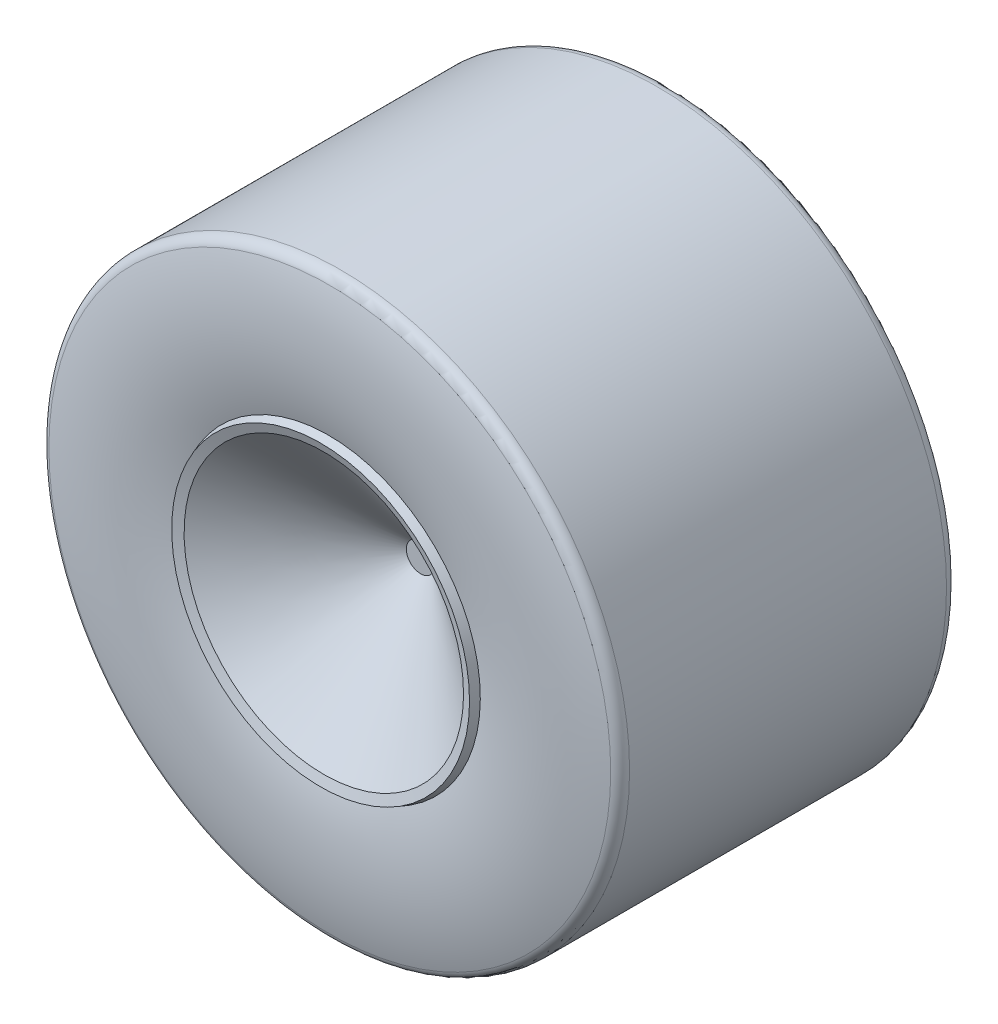
ISO-10303-21;
HEADER;
FILE_DESCRIPTION(('STEP AP214'),'2;1');
FILE_NAME('part.step','',(''),(''),'','','');
FILE_SCHEMA(('AUTOMOTIVE_DESIGN { 1 0 10303 214 1 1 1 1 }'));
ENDSEC;
DATA;
#1=APPLICATION_CONTEXT('core data for automotive mechanical design processes');
#2=APPLICATION_PROTOCOL_DEFINITION('international standard','automotive_design',2000,#1);
#3=PRODUCT_CONTEXT('',#1,'mechanical');
#4=PRODUCT('Part','Part','',(#3));
#5=PRODUCT_RELATED_PRODUCT_CATEGORY('part','',(#4));
#6=PRODUCT_DEFINITION_FORMATION('','',#4);
#7=PRODUCT_DEFINITION_CONTEXT('part definition',#1,'design');
#8=PRODUCT_DEFINITION('design','',#6,#7);
#9=PRODUCT_DEFINITION_SHAPE('','',#8);
#10=(LENGTH_UNIT() NAMED_UNIT(*) SI_UNIT(.MILLI.,.METRE.));
#11=(NAMED_UNIT(*) PLANE_ANGLE_UNIT() SI_UNIT($,.RADIAN.));
#12=(NAMED_UNIT(*) SI_UNIT($,.STERADIAN.) SOLID_ANGLE_UNIT());
#13=UNCERTAINTY_MEASURE_WITH_UNIT(LENGTH_MEASURE(1.E-05),#10,'distance_accuracy_value','');
#14=(GEOMETRIC_REPRESENTATION_CONTEXT(3) GLOBAL_UNCERTAINTY_ASSIGNED_CONTEXT((#13)) GLOBAL_UNIT_ASSIGNED_CONTEXT((#10,
#11,#12)) REPRESENTATION_CONTEXT('',''));
#15=CARTESIAN_POINT('',(0.,0.,0.));
#16=DIRECTION('',(0.,0.,1.));
#17=DIRECTION('',(1.,0.,0.));
#18=AXIS2_PLACEMENT_3D('',#15,#16,#17);
#19=CARTESIAN_POINT('',(-12.876773411203,8.39824216841942E-13,148.786821948913));
#20=DIRECTION('',(0.,0.,1.));
#21=DIRECTION('',(0.981554572139134,0.191182169442552,0.));
#22=AXIS2_PLACEMENT_3D('',#19,#20,#21);
#23=DEGENERATE_TOROIDAL_SURFACE('',#22,97.5,108.125,.T.);
#24=CARTESIAN_POINT('',(-12.876773411203,8.39824216841942E-13,45.6618219489127));
#25=DIRECTION('',(0.,0.,1.));
#26=DIRECTION('',(0.981554572139134,0.191182169442552,0.));
#27=AXIS2_PLACEMENT_3D('',#24,#25,#26);
#28=CIRCLE('',#27,65.);
#29=CARTESIAN_POINT('',(50.9242737778408,12.4268410137667,45.6618219489126));
#30=VERTEX_POINT('',#29);
#31=EDGE_CURVE('P0_E45',#30,#30,#28,.T.);
#32=ORIENTED_EDGE('',*,*,#31,.F.);
#33=EDGE_LOOP('',(#32));
#34=FACE_BOUND('',#33,.T.);
#35=CARTESIAN_POINT('',(-12.876773411203,8.39824216841942E-13,44.6993886766583));
#36=DIRECTION('',(0.,0.,1.));
#37=DIRECTION('',(0.981554572139134,0.191182169442552,0.));
#38=AXIS2_PLACEMENT_3D('',#35,#36,#37);
#39=CIRCLE('',#38,68.2284803982778);
#40=CARTESIAN_POINT('',(54.0932034738319,13.0440689003122,44.6993886766583));
#41=VERTEX_POINT('',#40);
#42=EDGE_CURVE('P0_E10',#41,#41,#39,.T.);
#43=ORIENTED_EDGE('',*,*,#42,.T.);
#44=EDGE_LOOP('',(#43));
#45=FACE_BOUND('',#44,.T.);
#46=ADVANCED_FACE('P0_F14',(#34,#45),#23,.F.);
#47=CARTESIAN_POINT('',(-12.876773411203,8.39824216841942E-13,41.1009057531137));
#48=DIRECTION('',(0.,0.,1.));
#49=DIRECTION('',(0.981554572139134,0.191182169442552,0.));
#50=AXIS2_PLACEMENT_3D('',#47,#48,#49);
#51=CONICAL_SURFACE('',#50,66.9788219170358,0.334243983225445);
#52=CARTESIAN_POINT('',(-12.876773411203,8.39824216841942E-13,41.1009057531137));
#53=DIRECTION('',(0.,0.,1.));
#54=DIRECTION('',(0.981554572139134,0.191182169442552,0.));
#55=AXIS2_PLACEMENT_3D('',#52,#53,#54);
#56=CIRCLE('',#55,66.9788219170358);
#57=CARTESIAN_POINT('',(52.8665954779564,12.8051564808061,41.1009057531137));
#58=VERTEX_POINT('',#57);
#59=EDGE_CURVE('P0_E20',#58,#58,#56,.T.);
#60=CARTESIAN_POINT('',(54.0932034738319,13.0440689003122,44.6993886766583));
#61=CARTESIAN_POINT('',(54.0804263072082,13.0415802292757,44.661904479538));
#62=CARTESIAN_POINT('',(54.0676491405845,13.0390915582392,44.6244202824178));
#63=CARTESIAN_POINT('',(54.0420948073371,13.0341142161661,44.5494518881773));
#64=CARTESIAN_POINT('',(54.0293176407134,13.0316255451296,44.511967691057));
#65=CARTESIAN_POINT('',(54.003763307466,13.0266482030566,44.4369992968165));
#66=CARTESIAN_POINT('',(53.9909861408423,13.02415953202,44.3995150996962));
#67=CARTESIAN_POINT('',(53.9654318075949,13.019182189947,44.3245467054557));
#68=CARTESIAN_POINT('',(53.9526546409712,13.0166935189105,44.2870625083355));
#69=CARTESIAN_POINT('',(53.9271003077238,13.0117161768374,44.212094114095));
#70=CARTESIAN_POINT('',(53.9143231411001,13.0092275058009,44.1746099169747));
#71=CARTESIAN_POINT('',(53.8887688078526,13.0042501637279,44.0996415227342));
#72=CARTESIAN_POINT('',(53.8759916412289,13.0017614926913,44.0621573256139));
#73=CARTESIAN_POINT('',(53.8504373079815,12.9967841506183,43.9871889313734));
#74=CARTESIAN_POINT('',(53.8376601413578,12.9942954795818,43.9497047342532));
#75=CARTESIAN_POINT('',(53.8121058081104,12.9893181375087,43.8747363400126));
#76=CARTESIAN_POINT('',(53.7993286414867,12.9868294664722,43.8372521428924));
#77=CARTESIAN_POINT('',(53.7737743082393,12.9818521243992,43.7622837486519));
#78=CARTESIAN_POINT('',(53.7609971416156,12.9793634533626,43.7247995515316));
#79=CARTESIAN_POINT('',(53.7354428083682,12.9743861112896,43.6498311572911));
#80=CARTESIAN_POINT('',(53.7226656417445,12.9718974402531,43.6123469601708));
#81=CARTESIAN_POINT('',(53.6971113084971,12.96692009818,43.5373785659303));
#82=CARTESIAN_POINT('',(53.6843341418734,12.9644314271435,43.4998943688101));
#83=CARTESIAN_POINT('',(53.658779808626,12.9594540850705,43.4249259745696));
#84=CARTESIAN_POINT('',(53.6460026420023,12.9569654140339,43.3874417774493));
#85=CARTESIAN_POINT('',(53.6204483087549,12.9519880719609,43.3124733832088));
#86=CARTESIAN_POINT('',(53.6076711421312,12.9494994009244,43.2749891860885));
#87=CARTESIAN_POINT('',(53.5821168088838,12.9445220588513,43.200020791848));
#88=CARTESIAN_POINT('',(53.5693396422601,12.9420333878148,43.1625365947278));
#89=CARTESIAN_POINT('',(53.5437853090127,12.9370560457418,43.0875682004873));
#90=CARTESIAN_POINT('',(53.531008142389,12.9345673747052,43.050084003367));
#91=CARTESIAN_POINT('',(53.5054538091415,12.9295900326322,42.9751156091265));
#92=CARTESIAN_POINT('',(53.4926766425178,12.9271013615957,42.9376314120062));
#93=CARTESIAN_POINT('',(53.4671223092704,12.9221240195226,42.8626630177657));
#94=CARTESIAN_POINT('',(53.4543451426467,12.9196353484861,42.8251788206455));
#95=CARTESIAN_POINT('',(53.4287908093993,12.9146580064131,42.7502104264049));
#96=CARTESIAN_POINT('',(53.4160136427756,12.9121693353765,42.7127262292847));
#97=CARTESIAN_POINT('',(53.3904593095282,12.9071919933035,42.6377578350442));
#98=CARTESIAN_POINT('',(53.3776821429045,12.904703322267,42.6002736379239));
#99=CARTESIAN_POINT('',(53.3521278096571,12.8997259801939,42.5253052436834));
#100=CARTESIAN_POINT('',(53.3393506430334,12.8972373091574,42.4878210465631));
#101=CARTESIAN_POINT('',(53.313796309786,12.8922599670844,42.4128526523226));
#102=CARTESIAN_POINT('',(53.3010191431623,12.8897712960478,42.3753684552024));
#103=CARTESIAN_POINT('',(53.2754648099149,12.8847939539748,42.3004000609619));
#104=CARTESIAN_POINT('',(53.2626876432912,12.8823052829383,42.2629158638416));
#105=CARTESIAN_POINT('',(53.2371333100438,12.8773279408652,42.1879474696011));
#106=CARTESIAN_POINT('',(53.2243561434201,12.8748392698287,42.1504632724808));
#107=CARTESIAN_POINT('',(53.1988018101727,12.8698619277557,42.0754948782403));
#108=CARTESIAN_POINT('',(53.186024643549,12.8673732567191,42.0380106811201));
#109=CARTESIAN_POINT('',(53.1604703103015,12.8623959146461,41.9630422868795));
#110=CARTESIAN_POINT('',(53.1476931436778,12.8599072436096,41.9255580897593));
#111=CARTESIAN_POINT('',(53.1221388104304,12.8549299015365,41.8505896955188));
#112=CARTESIAN_POINT('',(53.1093616438067,12.8524412305,41.8131054983985));
#113=CARTESIAN_POINT('',(53.0838073105593,12.847463888427,41.738137104158));
#114=CARTESIAN_POINT('',(53.0710301439356,12.8449752173904,41.7006529070377));
#115=CARTESIAN_POINT('',(53.0454758106882,12.8399978753174,41.6256845127972));
#116=CARTESIAN_POINT('',(53.0326986440645,12.8375092042809,41.588200315677));
#117=CARTESIAN_POINT('',(53.0071443108171,12.8325318622078,41.5132319214365));
#118=CARTESIAN_POINT('',(52.9943671441934,12.8300431911713,41.4757477243162));
#119=CARTESIAN_POINT('',(52.968812810946,12.8250658490983,41.4007793300757));
#120=CARTESIAN_POINT('',(52.9560356443223,12.8225771780617,41.3632951329554));
#121=CARTESIAN_POINT('',(52.9304813110749,12.8175998359887,41.2883267387149));
#122=CARTESIAN_POINT('',(52.9177041444512,12.8151111649522,41.2508425415947));
#123=CARTESIAN_POINT('',(52.8921498112038,12.8101338228791,41.1758741473542));
#124=CARTESIAN_POINT('',(52.8793726445801,12.8076451518426,41.1383899502339));
#125=CARTESIAN_POINT('',(52.8665954779564,12.8051564808061,41.1009057531137));
#126=B_SPLINE_CURVE_WITH_KNOTS('',3,(#60,#61,#62,#63,#64,#65,#66,#67,#68,#69,#70,#71,#72,#73,
#74,#75,#76,#77,#78,#79,#80,#81,#82,#83,#84,#85,#86,#87,#88,#89,#90,#91,#92,#93,#94,#95,#96,#97,
#98,#99,#100,#101,#102,#103,#104,#105,#106,#107,#108,#109,#110,#111,#112,#113,#114,#115,#116,
#117,#118,#119,#120,#121,#122,#123,#124,#125),.UNSPECIFIED.,.F.,.F.,(4,2,2,2,2,2,2,2,2,2,2,2,2,
2,2,2,2,2,2,2,2,2,2,2,2,2,2,2,2,2,2,2,4),(0.,0.119040457567467,0.238080915134945,
0.357121372702419,0.476161830269897,0.595202287837365,0.714242745404843,0.833283202972317,
0.95232366053979,1.07136411810726,1.19040457567474,1.30944503324221,1.42848549080969,
1.54752594837716,1.66656640594463,1.78560686351211,1.90464732107958,2.02368777864705,
2.14272823621453,2.261768693782,2.38080915134948,2.49984960891694,2.61889006648442,
2.7379305240519,2.85697098161937,2.97601143918684,3.09505189675432,3.21409235432179,
3.33313281188927,3.45217326945674,3.57121372702421,3.69025418459169,3.80929464215916),.UNSPECIFIED.);
#127=EDGE_CURVE('P0_BSEAM52',#41,#58,#126,.T.);
#128=ORIENTED_EDGE('',*,*,#42,.F.);
#129=ORIENTED_EDGE('',*,*,#59,.T.);
#130=ORIENTED_EDGE('',*,*,#127,.T.);
#131=ORIENTED_EDGE('',*,*,#127,.F.);
#132=EDGE_LOOP('',(#128,#130,#129,#131));
#133=FACE_BOUND('',#132,.T.);
#134=ADVANCED_FACE('P0_F52',(#133),#51,.T.);
#135=CARTESIAN_POINT('',(-12.876773411203,8.39824216841942E-13,42.5367890580198));
#136=DIRECTION('',(0.,0.,-1.));
#137=DIRECTION('',(-0.981554572139134,-0.191182169442552,0.));
#138=AXIS2_PLACEMENT_3D('',#135,#136,#137);
#139=CONICAL_SURFACE('',#138,62.8440910041769,1.23655234356945);
#140=ORIENTED_EDGE('',*,*,#59,.F.);
#141=EDGE_LOOP('',(#140));
#142=FACE_BOUND('',#141,.T.);
#143=CARTESIAN_POINT('',(-12.876773411203,8.39824216841942E-13,42.5367890580198));
#144=DIRECTION('',(0.,0.,1.));
#145=DIRECTION('',(0.981554572139134,0.191182169442552,0.));
#146=AXIS2_PLACEMENT_3D('',#143,#144,#145);
#147=CIRCLE('',#146,62.8440910041769);
#148=CARTESIAN_POINT('',(48.8081314458747,12.0146696548245,42.5367890580198));
#149=VERTEX_POINT('',#148);
#150=EDGE_CURVE('P0_E24',#149,#149,#147,.T.);
#151=ORIENTED_EDGE('',*,*,#150,.T.);
#152=EDGE_LOOP('',(#151));
#153=FACE_BOUND('',#152,.T.);
#154=ADVANCED_FACE('P0_F57',(#142,#153),#139,.F.);
#155=CARTESIAN_POINT('',(-24.8914430660267,61.6849048570785,42.5367890580198));
#156=DIRECTION('',(0.,0.,1.));
#157=DIRECTION('',(0.981554572139134,0.191182169442552,0.));
#158=AXIS2_PLACEMENT_3D('',#155,#156,#157);
#159=PLANE('',#158);
#160=ORIENTED_EDGE('',*,*,#150,.F.);
#161=EDGE_LOOP('',(#160));
#162=FACE_BOUND('',#161,.T.);
#163=ADVANCED_FACE('P0_F62',(#162),#159,.F.);
#164=CARTESIAN_POINT('',(-14.0988966989597,6.27454277934612,155.272051573695));
#165=DIRECTION('',(0.,0.,-1.));
#166=DIRECTION('',(-0.981554572139134,-0.191182169442552,0.));
#167=AXIS2_PLACEMENT_3D('',#164,#165,#166);
#168=PLANE('',#167);
#169=CARTESIAN_POINT('',(-12.876773411203,8.39824216841942E-13,155.272051573695));
#170=DIRECTION('',(0.,0.,1.));
#171=DIRECTION('',(0.981554572139134,0.191182169442552,0.));
#172=AXIS2_PLACEMENT_3D('',#169,#170,#171);
#173=CIRCLE('',#172,6.39245433462855);
#174=CARTESIAN_POINT('',(-6.60223063185776,1.22212328775756,155.272051573695));
#175=VERTEX_POINT('',#174);
#176=EDGE_CURVE('P0_E28',#175,#175,#173,.T.);
#177=ORIENTED_EDGE('',*,*,#176,.T.);
#178=EDGE_LOOP('',(#177));
#179=FACE_BOUND('',#178,.T.);
#180=ADVANCED_FACE('P0_F68',(#179),#168,.F.);
#181=CARTESIAN_POINT('',(-12.876773411203,8.39824216841942E-13,198.786854839805));
#182=DIRECTION('',(0.,0.,1.));
#183=DIRECTION('',(0.981554572139134,0.191182169442552,0.));
#184=AXIS2_PLACEMENT_3D('',#181,#182,#183);
#185=CONICAL_SURFACE('',#184,62.8440910041769,0.914094664675462);
#186=CARTESIAN_POINT('',(-12.876773411203,8.39824216841942E-13,198.786854839805));
#187=DIRECTION('',(0.,0.,1.));
#188=DIRECTION('',(0.981554572139134,0.191182169442552,0.));
#189=AXIS2_PLACEMENT_3D('',#186,#187,#188);
#190=CIRCLE('',#189,62.8440910041769);
#191=CARTESIAN_POINT('',(48.8081314458747,12.0146696548245,198.786854839805));
#192=VERTEX_POINT('',#191);
#193=EDGE_CURVE('P0_E33',#192,#192,#190,.T.);
#194=CARTESIAN_POINT('',(-6.60223063185776,1.22212328775756,155.272051573695));
#195=CARTESIAN_POINT('',(-6.02503936021472,1.33454564574784,155.725330774384));
#196=CARTESIAN_POINT('',(-5.44784808857167,1.44696800373813,156.178609975073));
#197=CARTESIAN_POINT('',(-4.29346554528557,1.67181271971869,157.08516837645));
#198=CARTESIAN_POINT('',(-3.71627427364253,1.78423507770897,157.538447577138));
#199=CARTESIAN_POINT('',(-2.56189173035643,2.00907979368953,158.445005978516));
#200=CARTESIAN_POINT('',(-1.98470045871339,2.12150215167981,158.898285179204));
#201=CARTESIAN_POINT('',(-0.8303179154273,2.34634686766037,159.804843580582));
#202=CARTESIAN_POINT('',(-0.253126643784258,2.45876922565065,160.25812278127));
#203=CARTESIAN_POINT('',(0.901255899501835,2.68361394163122,161.164681182648));
#204=CARTESIAN_POINT('',(1.47844717114488,2.7960362996215,161.617960383336));
#205=CARTESIAN_POINT('',(2.63282971443098,3.02088101560206,162.524518784714));
#206=CARTESIAN_POINT('',(3.21002098607403,3.13330337359234,162.977797985402));
#207=CARTESIAN_POINT('',(4.36440352936012,3.3581480895729,163.88435638678));
#208=CARTESIAN_POINT('',(4.94159480100316,3.47057044756318,164.337635587468));
#209=CARTESIAN_POINT('',(6.09597734428926,3.69541516354374,165.244193988845));
#210=CARTESIAN_POINT('',(6.6731686159323,3.80783752153403,165.697473189534));
#211=CARTESIAN_POINT('',(7.82755115921839,4.03268223751459,166.604031590911));
#212=CARTESIAN_POINT('',(8.40474243086144,4.14510459550487,167.0573107916));
#213=CARTESIAN_POINT('',(9.55912497414753,4.36994931148543,167.963869192977));
#214=CARTESIAN_POINT('',(10.1363162457906,4.48237166947571,168.417148393666));
#215=CARTESIAN_POINT('',(11.2906987890767,4.70721638545627,169.323706795043));
#216=CARTESIAN_POINT('',(11.8678900607197,4.81963874344656,169.776985995732));
#217=CARTESIAN_POINT('',(13.0222726040058,5.04448345942712,170.683544397109));
#218=CARTESIAN_POINT('',(13.5994638756489,5.1569058174174,171.136823597798));
#219=CARTESIAN_POINT('',(14.753846418935,5.38175053339796,172.043381999175));
#220=CARTESIAN_POINT('',(15.331037690578,5.49417289138824,172.496661199864));
#221=CARTESIAN_POINT('',(16.4854202338641,5.7190176073688,173.403219601241));
#222=CARTESIAN_POINT('',(17.0626115055071,5.83143996535908,173.85649880193));
#223=CARTESIAN_POINT('',(18.2169940487932,6.05628468133965,174.763057203307));
#224=CARTESIAN_POINT('',(18.7941853204363,6.16870703932993,175.216336403996));
#225=CARTESIAN_POINT('',(19.9485678637224,6.39355175531049,176.122894805373));
#226=CARTESIAN_POINT('',(20.5257591353654,6.50597411330077,176.576174006062));
#227=CARTESIAN_POINT('',(21.6801416786515,6.73081882928133,177.482732407439));
#228=CARTESIAN_POINT('',(22.2573329502946,6.84324118727161,177.936011608128));
#229=CARTESIAN_POINT('',(23.4117154935806,7.06808590325218,178.842570009505));
#230=CARTESIAN_POINT('',(23.9889067652237,7.18050826124246,179.295849210194));
#231=CARTESIAN_POINT('',(25.1432893085098,7.40535297722302,180.202407611571));
#232=CARTESIAN_POINT('',(25.7204805801528,7.5177753352133,180.65568681226));
#233=CARTESIAN_POINT('',(26.8748631234389,7.74262005119386,181.562245213637));
#234=CARTESIAN_POINT('',(27.452054395082,7.85504240918414,182.015524414325));
#235=CARTESIAN_POINT('',(28.6064369383681,8.0798871251647,182.922082815703));
#236=CARTESIAN_POINT('',(29.1836282100111,8.19230948315499,183.375362016391));
#237=CARTESIAN_POINT('',(30.3380107532972,8.41715419913555,184.281920417769));
#238=CARTESIAN_POINT('',(30.9152020249403,8.52957655712583,184.735199618457));
#239=CARTESIAN_POINT('',(32.0695845682263,8.75442127310639,185.641758019835));
#240=CARTESIAN_POINT('',(32.6467758398694,8.86684363109667,186.095037220523));
#241=CARTESIAN_POINT('',(33.8011583831555,9.09168834707723,187.001595621901));
#242=CARTESIAN_POINT('',(34.3783496547985,9.20411070506751,187.454874822589));
#243=CARTESIAN_POINT('',(35.5327321980846,9.42895542104808,188.361433223967));
#244=CARTESIAN_POINT('',(36.1099234697277,9.54137777903836,188.814712424655));
#245=CARTESIAN_POINT('',(37.2643060130138,9.76622249501892,189.721270826032));
#246=CARTESIAN_POINT('',(37.8414972846568,9.8786448530092,190.174550026721));
#247=CARTESIAN_POINT('',(38.9958798279429,10.1034895689898,191.081108428098));
#248=CARTESIAN_POINT('',(39.5730710995859,10.21591192698,191.534387628787));
#249=CARTESIAN_POINT('',(40.727453642872,10.4407566429606,192.440946030164));
#250=CARTESIAN_POINT('',(41.3046449145151,10.5531790009509,192.894225230853));
#251=CARTESIAN_POINT('',(42.4590274578012,10.7780237169314,193.80078363223));
#252=CARTESIAN_POINT('',(43.0362187294442,10.8904460749217,194.254062832919));
#253=CARTESIAN_POINT('',(44.1906012727303,11.1152907909023,195.160621234296));
#254=CARTESIAN_POINT('',(44.7677925443734,11.2277131488926,195.613900434985));
#255=CARTESIAN_POINT('',(45.9221750876595,11.4525578648731,196.520458836362));
#256=CARTESIAN_POINT('',(46.4993663593025,11.5649802228634,196.973738037051));
#257=CARTESIAN_POINT('',(47.6537489025886,11.789824938844,197.880296438428));
#258=CARTESIAN_POINT('',(48.2309401742316,11.9022472968343,198.333575639117));
#259=CARTESIAN_POINT('',(48.8081314458747,12.0146696548245,198.786854839805));
#260=B_SPLINE_CURVE_WITH_KNOTS('',3,(#194,#195,#196,#197,#198,#199,#200,#201,#202,#203,#204,
#205,#206,#207,#208,#209,#210,#211,#212,#213,#214,#215,#216,#217,#218,#219,#220,#221,#222,#223,
#224,#225,#226,#227,#228,#229,#230,#231,#232,#233,#234,#235,#236,#237,#238,#239,#240,#241,#242,
#243,#244,#245,#246,#247,#248,#249,#250,#251,#252,#253,#254,#255,#256,#257,#258,#259),
.UNSPECIFIED.,.F.,.F.,(4,2,2,2,2,2,2,2,2,2,2,2,2,2,2,2,2,2,2,2,2,2,2,2,2,2,2,2,2,2,2,2,4),(0.,
2.2273875414318,4.45477508286358,6.68216262429538,8.90955016572718,11.136937707159,
13.3643252485908,15.5917127900226,17.8191003314543,20.0464878728861,22.2738754143179,
24.5012629557497,26.7286504971815,28.9560380386133,31.1834255800451,33.4108131214769,
35.6382006629087,37.8655882043405,40.0929757457723,42.3203632872041,44.5477508286359,
46.7751383700677,49.0025259114994,51.2299134529312,53.4573009943631,55.6846885357948,
57.9120760772266,60.1394636186584,62.3668511600902,64.594238701522,66.8216262429538,
69.0490137843856,71.2764013258174),.UNSPECIFIED.);
#261=EDGE_CURVE('P0_BSEAM72',#175,#192,#260,.T.);
#262=ORIENTED_EDGE('',*,*,#176,.F.);
#263=ORIENTED_EDGE('',*,*,#193,.T.);
#264=ORIENTED_EDGE('',*,*,#261,.T.);
#265=ORIENTED_EDGE('',*,*,#261,.F.);
#266=EDGE_LOOP('',(#262,#264,#263,#265));
#267=FACE_BOUND('',#266,.T.);
#268=ADVANCED_FACE('P0_F72',(#267),#185,.F.);
#269=CARTESIAN_POINT('',(-12.876773411203,8.39824216841942E-13,200.222738144712));
#270=DIRECTION('',(0.,0.,1.));
#271=DIRECTION('',(0.981554572139134,0.191182169442552,0.));
#272=AXIS2_PLACEMENT_3D('',#269,#270,#271);
#273=CONICAL_SURFACE('',#272,66.9788219170358,1.23655234356945);
#274=CARTESIAN_POINT('',(-12.876773411203,8.39824216841942E-13,200.222738144712));
#275=DIRECTION('',(0.,0.,1.));
#276=DIRECTION('',(0.981554572139134,0.191182169442552,0.));
#277=AXIS2_PLACEMENT_3D('',#274,#275,#276);
#278=CIRCLE('',#277,66.9788219170358);
#279=CARTESIAN_POINT('',(52.8665954779563,12.8051564808061,200.222738144712));
#280=VERTEX_POINT('',#279);
#281=EDGE_CURVE('P0_E36',#280,#280,#278,.T.);
#282=CARTESIAN_POINT('',(48.8081314458746,12.0146696548245,198.786854839805));
#283=CARTESIAN_POINT('',(48.8504071128754,12.0229038925952,198.801811957565));
#284=CARTESIAN_POINT('',(48.8926827798763,12.0311381303658,198.816769075324));
#285=CARTESIAN_POINT('',(48.977234113878,12.0476066059071,198.846683310843));
#286=CARTESIAN_POINT('',(49.0195097808788,12.0558408436777,198.861640428603));
#287=CARTESIAN_POINT('',(49.1040611148805,12.072309319219,198.891554664122));
#288=CARTESIAN_POINT('',(49.1463367818814,12.0805435569896,198.906511781881));
#289=CARTESIAN_POINT('',(49.2308881158831,12.0970120325309,198.9364260174));
#290=CARTESIAN_POINT('',(49.2731637828839,12.1052462703016,198.951383135159));
#291=CARTESIAN_POINT('',(49.3577151168857,12.1217147458429,198.981297370678));
#292=CARTESIAN_POINT('',(49.3999907838865,12.1299489836135,198.996254488438));
#293=CARTESIAN_POINT('',(49.4845421178882,12.1464174591548,199.026168723956));
#294=CARTESIAN_POINT('',(49.5268177848891,12.1546516969254,199.041125841716));
#295=CARTESIAN_POINT('',(49.6113691188908,12.1711201724667,199.071040077235));
#296=CARTESIAN_POINT('',(49.6536447858916,12.1793544102373,199.085997194994));
#297=CARTESIAN_POINT('',(49.7381961198933,12.1958228857786,199.115911430513));
#298=CARTESIAN_POINT('',(49.7804717868942,12.2040571235493,199.130868548273));
#299=CARTESIAN_POINT('',(49.8650231208959,12.2205255990906,199.160782783791));
#300=CARTESIAN_POINT('',(49.9072987878967,12.2287598368612,199.175739901551));
#301=CARTESIAN_POINT('',(49.9918501218984,12.2452283124025,199.20565413707));
#302=CARTESIAN_POINT('',(50.0341257888993,12.2534625501731,199.220611254829));
#303=CARTESIAN_POINT('',(50.118677122901,12.2699310257144,199.250525490348));
#304=CARTESIAN_POINT('',(50.1609527899018,12.278165263485,199.265482608108));
#305=CARTESIAN_POINT('',(50.2455041239035,12.2946337390263,199.295396843626));
#306=CARTESIAN_POINT('',(50.2877797909044,12.302867976797,199.310353961386));
#307=CARTESIAN_POINT('',(50.3723311249061,12.3193364523382,199.340268196905));
#308=CARTESIAN_POINT('',(50.4146067919069,12.3275706901089,199.355225314664));
#309=CARTESIAN_POINT('',(50.4991581259086,12.3440391656502,199.385139550183));
#310=CARTESIAN_POINT('',(50.5414337929095,12.3522734034208,199.400096667942));
#311=CARTESIAN_POINT('',(50.6259851269112,12.3687418789621,199.430010903461));
#312=CARTESIAN_POINT('',(50.668260793912,12.3769761167327,199.444968021221));
#313=CARTESIAN_POINT('',(50.7528121279137,12.393444592274,199.47488225674));
#314=CARTESIAN_POINT('',(50.7950877949146,12.4016788300447,199.489839374499));
#315=CARTESIAN_POINT('',(50.8796391289163,12.4181473055859,199.519753610018));
#316=CARTESIAN_POINT('',(50.9219147959172,12.4263815433566,199.534710727777));
#317=CARTESIAN_POINT('',(51.0064661299189,12.4428500188979,199.564624963296));
#318=CARTESIAN_POINT('',(51.0487417969197,12.4510842566685,199.579582081056));
#319=CARTESIAN_POINT('',(51.1332931309214,12.4675527322098,199.609496316575));
#320=CARTESIAN_POINT('',(51.1755687979223,12.4757869699804,199.624453434334));
#321=CARTESIAN_POINT('',(51.260120131924,12.4922554455217,199.654367669853));
#322=CARTESIAN_POINT('',(51.3023957989248,12.5004896832924,199.669324787612));
#323=CARTESIAN_POINT('',(51.3869471329265,12.5169581588336,199.699239023131));
#324=CARTESIAN_POINT('',(51.4292227999274,12.5251923966043,199.714196140891));
#325=CARTESIAN_POINT('',(51.5137741339291,12.5416608721456,199.74411037641));
#326=CARTESIAN_POINT('',(51.5560498009299,12.5498951099162,199.759067494169));
#327=CARTESIAN_POINT('',(51.6406011349316,12.5663635854575,199.788981729688));
#328=CARTESIAN_POINT('',(51.6828768019325,12.5745978232281,199.803938847447));
#329=CARTESIAN_POINT('',(51.7674281359342,12.5910662987694,199.833853082966));
#330=CARTESIAN_POINT('',(51.809703802935,12.59930053654,199.848810200726));
#331=CARTESIAN_POINT('',(51.8942551369367,12.6157690120813,199.878724436245));
#332=CARTESIAN_POINT('',(51.9365308039376,12.624003249852,199.893681554004));
#333=CARTESIAN_POINT('',(52.0210821379393,12.6404717253933,199.923595789523));
#334=CARTESIAN_POINT('',(52.0633578049401,12.6487059631639,199.938552907282));
#335=CARTESIAN_POINT('',(52.1479091389418,12.6651744387052,199.968467142801));
#336=CARTESIAN_POINT('',(52.1901848059427,12.6734086764758,199.983424260561));
#337=CARTESIAN_POINT('',(52.2747361399444,12.6898771520171,200.013338496079));
#338=CARTESIAN_POINT('',(52.3170118069452,12.6981113897877,200.028295613839));
#339=CARTESIAN_POINT('',(52.4015631409469,12.714579865329,200.058209849358));
#340=CARTESIAN_POINT('',(52.4438388079478,12.7228141030997,200.073166967117));
#341=CARTESIAN_POINT('',(52.5283901419495,12.7392825786409,200.103081202636));
#342=CARTESIAN_POINT('',(52.5706658089504,12.7475168164116,200.118038320396));
#343=CARTESIAN_POINT('',(52.6552171429521,12.7639852919529,200.147952555914));
#344=CARTESIAN_POINT('',(52.6974928099529,12.7722195297235,200.162909673674));
#345=CARTESIAN_POINT('',(52.7820441439546,12.7886880052648,200.192823909193));
#346=CARTESIAN_POINT('',(52.8243198109555,12.7969222430354,200.207781026952));
#347=CARTESIAN_POINT('',(52.8665954779563,12.8051564808061,200.222738144712));
#348=B_SPLINE_CURVE_WITH_KNOTS('',3,(#282,#283,#284,#285,#286,#287,#288,#289,#290,#291,#292,
#293,#294,#295,#296,#297,#298,#299,#300,#301,#302,#303,#304,#305,#306,#307,#308,#309,#310,#311,
#312,#313,#314,#315,#316,#317,#318,#319,#320,#321,#322,#323,#324,#325,#326,#327,#328,#329,#330,
#331,#332,#333,#334,#335,#336,#337,#338,#339,#340,#341,#342,#343,#344,#345,#346,#347),
.UNSPECIFIED.,.F.,.F.,(4,2,2,2,2,2,2,2,2,2,2,2,2,2,2,2,2,2,2,2,2,2,2,2,2,2,2,2,2,2,2,2,4),(0.,
0.136779934834402,0.273559869668791,0.410339804503194,0.547119739337573,0.683899674171975,
0.820679609006364,0.95745954384076,1.09423947867515,1.23101941350954,1.36779934834394,
1.50457928317832,1.64135921801272,1.7781391528471,1.91491908768151,2.05169902251589,
2.18847895735029,2.32525889218468,2.46203882701908,2.59881876185347,2.73559869668787,
2.87237863152225,3.00915856635666,3.14593850119104,3.28271843602542,3.41949837085982,
3.55627830569421,3.69305824052861,3.829838175363,3.9666181101974,4.10339804503178,
4.24017797986619,4.37695791470057),.UNSPECIFIED.);
#349=EDGE_CURVE('P0_BSEAM76',#192,#280,#348,.T.);
#350=ORIENTED_EDGE('',*,*,#193,.F.);
#351=ORIENTED_EDGE('',*,*,#281,.T.);
#352=ORIENTED_EDGE('',*,*,#349,.T.);
#353=ORIENTED_EDGE('',*,*,#349,.F.);
#354=EDGE_LOOP('',(#350,#352,#351,#353));
#355=FACE_BOUND('',#354,.T.);
#356=ADVANCED_FACE('P0_F76',(#355),#273,.F.);
#357=CARTESIAN_POINT('',(-12.876773411203,8.39824216841942E-13,196.624255221167));
#358=DIRECTION('',(0.,0.,-1.));
#359=DIRECTION('',(-0.981554572139134,-0.191182169442552,0.));
#360=AXIS2_PLACEMENT_3D('',#357,#358,#359);
#361=CONICAL_SURFACE('',#360,68.2284803982778,0.334243983225445);
#362=ORIENTED_EDGE('',*,*,#281,.F.);
#363=EDGE_LOOP('',(#362));
#364=FACE_BOUND('',#363,.T.);
#365=CARTESIAN_POINT('',(-12.876773411203,8.39824216841942E-13,196.624255221167));
#366=DIRECTION('',(0.,0.,1.));
#367=DIRECTION('',(0.981554572139134,0.191182169442552,0.));
#368=AXIS2_PLACEMENT_3D('',#365,#366,#367);
#369=CIRCLE('',#368,68.2284803982778);
#370=CARTESIAN_POINT('',(54.0932034738319,13.0440689003122,196.624255221167));
#371=VERTEX_POINT('',#370);
#372=EDGE_CURVE('P0_E39',#371,#371,#369,.T.);
#373=ORIENTED_EDGE('',*,*,#372,.T.);
#374=EDGE_LOOP('',(#373));
#375=FACE_BOUND('',#374,.T.);
#376=ADVANCED_FACE('P0_F80',(#364,#375),#361,.T.);
#377=CARTESIAN_POINT('',(-12.876773411203,8.39824216841942E-13,92.5368219489127));
#378=DIRECTION('',(0.,0.,1.));
#379=DIRECTION('',(0.981554572139134,0.191182169442552,0.));
#380=AXIS2_PLACEMENT_3D('',#377,#378,#379);
#381=DEGENERATE_TOROIDAL_SURFACE('',#380,97.5,108.125,.T.);
#382=ORIENTED_EDGE('',*,*,#372,.F.);
#383=EDGE_LOOP('',(#382));
#384=FACE_BOUND('',#383,.T.);
#385=CARTESIAN_POINT('',(-12.876773411203,8.39824216841942E-13,195.661821948913));
#386=DIRECTION('',(0.,0.,1.));
#387=DIRECTION('',(0.981554572139134,0.191182169442552,0.));
#388=AXIS2_PLACEMENT_3D('',#385,#386,#387);
#389=CIRCLE('',#388,65.0000000000001);
#390=CARTESIAN_POINT('',(50.9242737778408,12.4268410137667,195.661821948913));
#391=VERTEX_POINT('',#390);
#392=EDGE_CURVE('P0_E42',#391,#391,#389,.T.);
#393=ORIENTED_EDGE('',*,*,#392,.T.);
#394=EDGE_LOOP('',(#393));
#395=FACE_BOUND('',#394,.T.);
#396=ADVANCED_FACE('P0_F84',(#384,#395),#381,.F.);
#397=CARTESIAN_POINT('',(-12.876773411203,8.39824216841942E-13,155.272051573695));
#398=DIRECTION('',(0.,0.,1.));
#399=DIRECTION('',(0.981554572139134,0.191182169442552,0.));
#400=AXIS2_PLACEMENT_3D('',#397,#398,#399);
#401=CYLINDRICAL_SURFACE('',#400,65.);
#402=CARTESIAN_POINT('',(50.9242737778408,12.4268410137667,195.661821948913));
#403=CARTESIAN_POINT('',(50.9242737778408,12.4268410137667,194.099321948913));
#404=CARTESIAN_POINT('',(50.9242737778408,12.4268410137667,192.536821948913));
#405=CARTESIAN_POINT('',(50.9242737778408,12.4268410137667,189.411821948913));
#406=CARTESIAN_POINT('',(50.9242737778408,12.4268410137667,187.849321948913));
#407=CARTESIAN_POINT('',(50.9242737778408,12.4268410137667,184.724321948913));
#408=CARTESIAN_POINT('',(50.9242737778408,12.4268410137667,183.161821948913));
#409=CARTESIAN_POINT('',(50.9242737778408,12.4268410137667,180.036821948913));
#410=CARTESIAN_POINT('',(50.9242737778408,12.4268410137667,178.474321948913));
#411=CARTESIAN_POINT('',(50.9242737778408,12.4268410137667,175.349321948913));
#412=CARTESIAN_POINT('',(50.9242737778408,12.4268410137667,173.786821948913));
#413=CARTESIAN_POINT('',(50.9242737778408,12.4268410137667,170.661821948913));
#414=CARTESIAN_POINT('',(50.9242737778408,12.4268410137667,169.099321948913));
#415=CARTESIAN_POINT('',(50.9242737778408,12.4268410137667,165.974321948913));
#416=CARTESIAN_POINT('',(50.9242737778408,12.4268410137667,164.411821948913));
#417=CARTESIAN_POINT('',(50.9242737778408,12.4268410137667,161.286821948913));
#418=CARTESIAN_POINT('',(50.9242737778408,12.4268410137667,159.724321948913));
#419=CARTESIAN_POINT('',(50.9242737778408,12.4268410137667,156.599321948913));
#420=CARTESIAN_POINT('',(50.9242737778408,12.4268410137667,155.036821948913));
#421=CARTESIAN_POINT('',(50.9242737778408,12.4268410137667,151.911821948913));
#422=CARTESIAN_POINT('',(50.9242737778408,12.4268410137667,150.349321948913));
#423=CARTESIAN_POINT('',(50.9242737778408,12.4268410137667,147.224321948913));
#424=CARTESIAN_POINT('',(50.9242737778408,12.4268410137667,145.661821948913));
#425=CARTESIAN_POINT('',(50.9242737778408,12.4268410137667,142.536821948913));
#426=CARTESIAN_POINT('',(50.9242737778408,12.4268410137667,140.974321948913));
#427=CARTESIAN_POINT('',(50.9242737778408,12.4268410137667,137.849321948913));
#428=CARTESIAN_POINT('',(50.9242737778408,12.4268410137667,136.286821948913));
#429=CARTESIAN_POINT('',(50.9242737778408,12.4268410137667,133.161821948913));
#430=CARTESIAN_POINT('',(50.9242737778408,12.4268410137667,131.599321948913));
#431=CARTESIAN_POINT('',(50.9242737778408,12.4268410137667,128.474321948913));
#432=CARTESIAN_POINT('',(50.9242737778408,12.4268410137667,126.911821948913));
#433=CARTESIAN_POINT('',(50.9242737778408,12.4268410137667,123.786821948913));
#434=CARTESIAN_POINT('',(50.9242737778408,12.4268410137667,122.224321948913));
#435=CARTESIAN_POINT('',(50.9242737778408,12.4268410137667,119.099321948913));
#436=CARTESIAN_POINT('',(50.9242737778408,12.4268410137667,117.536821948913));
#437=CARTESIAN_POINT('',(50.9242737778408,12.4268410137667,114.411821948913));
#438=CARTESIAN_POINT('',(50.9242737778408,12.4268410137667,112.849321948913));
#439=CARTESIAN_POINT('',(50.9242737778408,12.4268410137667,109.724321948913));
#440=CARTESIAN_POINT('',(50.9242737778408,12.4268410137667,108.161821948913));
#441=CARTESIAN_POINT('',(50.9242737778408,12.4268410137667,105.036821948913));
#442=CARTESIAN_POINT('',(50.9242737778408,12.4268410137667,103.474321948913));
#443=CARTESIAN_POINT('',(50.9242737778408,12.4268410137667,100.349321948913));
#444=CARTESIAN_POINT('',(50.9242737778408,12.4268410137667,98.7868219489127));
#445=CARTESIAN_POINT('',(50.9242737778408,12.4268410137667,95.6618219489127));
#446=CARTESIAN_POINT('',(50.9242737778408,12.4268410137667,94.0993219489127));
#447=CARTESIAN_POINT('',(50.9242737778408,12.4268410137667,90.9743219489127));
#448=CARTESIAN_POINT('',(50.9242737778408,12.4268410137667,89.4118219489127));
#449=CARTESIAN_POINT('',(50.9242737778408,12.4268410137667,86.2868219489127));
#450=CARTESIAN_POINT('',(50.9242737778408,12.4268410137667,84.7243219489127));
#451=CARTESIAN_POINT('',(50.9242737778408,12.4268410137667,81.5993219489127));
#452=CARTESIAN_POINT('',(50.9242737778408,12.4268410137667,80.0368219489127));
#453=CARTESIAN_POINT('',(50.9242737778408,12.4268410137667,76.9118219489127));
#454=CARTESIAN_POINT('',(50.9242737778408,12.4268410137667,75.3493219489127));
#455=CARTESIAN_POINT('',(50.9242737778408,12.4268410137667,72.2243219489127));
#456=CARTESIAN_POINT('',(50.9242737778408,12.4268410137667,70.6618219489127));
#457=CARTESIAN_POINT('',(50.9242737778408,12.4268410137667,67.5368219489127));
#458=CARTESIAN_POINT('',(50.9242737778408,12.4268410137667,65.9743219489127));
#459=CARTESIAN_POINT('',(50.9242737778408,12.4268410137667,62.8493219489127));
#460=CARTESIAN_POINT('',(50.9242737778408,12.4268410137667,61.2868219489127));
#461=CARTESIAN_POINT('',(50.9242737778408,12.4268410137667,58.1618219489127));
#462=CARTESIAN_POINT('',(50.9242737778408,12.4268410137667,56.5993219489127));
#463=CARTESIAN_POINT('',(50.9242737778408,12.4268410137667,53.4743219489127));
#464=CARTESIAN_POINT('',(50.9242737778408,12.4268410137667,51.9118219489127));
#465=CARTESIAN_POINT('',(50.9242737778408,12.4268410137667,48.7868219489127));
#466=CARTESIAN_POINT('',(50.9242737778408,12.4268410137667,47.2243219489127));
#467=CARTESIAN_POINT('',(50.9242737778408,12.4268410137667,45.6618219489127));
#468=B_SPLINE_CURVE_WITH_KNOTS('',3,(#402,#403,#404,#405,#406,#407,#408,#409,#410,#411,#412,
#413,#414,#415,#416,#417,#418,#419,#420,#421,#422,#423,#424,#425,#426,#427,#428,#429,#430,#431,
#432,#433,#434,#435,#436,#437,#438,#439,#440,#441,#442,#443,#444,#445,#446,#447,#448,#449,#450,
#451,#452,#453,#454,#455,#456,#457,#458,#459,#460,#461,#462,#463,#464,#465,#466,#467),
.UNSPECIFIED.,.F.,.F.,(4,2,2,2,2,2,2,2,2,2,2,2,2,2,2,2,2,2,2,2,2,2,2,2,2,2,2,2,2,2,2,2,4),(0.,
4.68749999999998,9.37499999999999,14.0625,18.75,23.4375,28.125,32.8125,37.5,42.1875,46.875,
51.5625,56.25,60.9375,65.625,70.3125,75.,79.6875,84.375,89.0625,93.75,98.4375,103.125,107.8125,
112.5,117.1875,121.875,126.5625,131.25,135.9375,140.625,145.3125,150.),.UNSPECIFIED.);
#469=EDGE_CURVE('P0_BSEAM49',#391,#30,#468,.T.);
#470=ORIENTED_EDGE('',*,*,#392,.F.);
#471=ORIENTED_EDGE('',*,*,#31,.T.);
#472=ORIENTED_EDGE('',*,*,#469,.T.);
#473=ORIENTED_EDGE('',*,*,#469,.F.);
#474=EDGE_LOOP('',(#470,#472,#471,#473));
#475=FACE_BOUND('',#474,.T.);
#476=ADVANCED_FACE('P0_F49',(#475),#401,.T.);
#477=CLOSED_SHELL('',(#46,#134,#154,#163,#180,#268,#356,#376,#396,#476));
#478=MANIFOLD_SOLID_BREP('P0_B1',#477);
#479=CARTESIAN_POINT('',(-12.876773411203,8.37955521322576E-13,120.000000000021));
#480=DIRECTION('',(0.,0.,1.));
#481=DIRECTION('',(1.,0.,0.));
#482=AXIS2_PLACEMENT_3D('',#479,#480,#481);
#483=CYLINDRICAL_SURFACE('',#482,130.);
#484=CARTESIAN_POINT('',(-12.876773411203,8.37955521322576E-13,48.7342779732648));
#485=DIRECTION('',(0.,0.,1.));
#486=DIRECTION('',(1.,0.,0.));
#487=AXIS2_PLACEMENT_3D('',#484,#485,#486);
#488=CIRCLE('',#487,130.);
#489=CARTESIAN_POINT('',(117.123226588797,8.37955521322576E-13,48.7342779732648));
#490=VERTEX_POINT('',#489);
#491=EDGE_CURVE('P1_E36',#490,#490,#488,.T.);
#492=ORIENTED_EDGE('',*,*,#491,.T.);
#493=EDGE_LOOP('',(#492));
#494=FACE_BOUND('',#493,.T.);
#495=CARTESIAN_POINT('',(-12.876773411203,8.37955521322576E-13,191.265722026778));
#496=DIRECTION('',(0.,0.,1.));
#497=DIRECTION('',(1.,0.,0.));
#498=AXIS2_PLACEMENT_3D('',#495,#496,#497);
#499=CIRCLE('',#498,130.);
#500=CARTESIAN_POINT('',(117.123226588797,8.37955521322576E-13,191.265722026778));
#501=VERTEX_POINT('',#500);
#502=EDGE_CURVE('P1_E10',#501,#501,#499,.T.);
#503=ORIENTED_EDGE('',*,*,#502,.F.);
#504=EDGE_LOOP('',(#503));
#505=FACE_BOUND('',#504,.T.);
#506=ADVANCED_FACE('P1_F14',(#494,#505),#483,.T.);
#507=CARTESIAN_POINT('',(-12.876773411203,8.37955521322576E-13,191.265722026778));
#508=DIRECTION('',(0.,0.,1.));
#509=DIRECTION('',(1.,0.,0.));
#510=AXIS2_PLACEMENT_3D('',#507,#508,#509);
#511=TOROIDAL_SURFACE('',#510,125.,5.00000000000001);
#512=CARTESIAN_POINT('',(-12.876773411203,8.37955521322576E-13,196.084666125045));
#513=DIRECTION('',(0.,0.,1.));
#514=DIRECTION('',(1.,0.,0.));
#515=AXIS2_PLACEMENT_3D('',#512,#513,#514);
#516=CIRCLE('',#515,126.333333333333);
#517=CARTESIAN_POINT('',(113.45655992213,8.37955521322576E-13,196.084666125045));
#518=VERTEX_POINT('',#517);
#519=EDGE_CURVE('P1_E20',#518,#518,#516,.T.);
#520=ORIENTED_EDGE('',*,*,#519,.F.);
#521=EDGE_LOOP('',(#520));
#522=FACE_BOUND('',#521,.T.);
#523=ORIENTED_EDGE('',*,*,#502,.T.);
#524=EDGE_LOOP('',(#523));
#525=FACE_BOUND('',#524,.T.);
#526=ADVANCED_FACE('P1_F61',(#522,#525),#511,.T.);
#527=CARTESIAN_POINT('',(-12.876773411203,8.37955521322576E-13,91.8750000000215));
#528=DIRECTION('',(0.,0.,1.));
#529=DIRECTION('',(1.,0.,0.));
#530=AXIS2_PLACEMENT_3D('',#527,#528,#529);
#531=DEGENERATE_TOROIDAL_SURFACE('',#530,97.5,108.125,.T.);
#532=CARTESIAN_POINT('',(-12.876773411203,8.37955521322576E-13,195.000000000021));
#533=DIRECTION('',(0.,0.,1.));
#534=DIRECTION('',(1.,0.,0.));
#535=AXIS2_PLACEMENT_3D('',#532,#533,#534);
#536=CIRCLE('',#535,65.);
#537=CARTESIAN_POINT('',(52.123226588797,8.37955521322576E-13,195.000000000021));
#538=VERTEX_POINT('',#537);
#539=EDGE_CURVE('P1_E24',#538,#538,#536,.T.);
#540=ORIENTED_EDGE('',*,*,#539,.F.);
#541=EDGE_LOOP('',(#540));
#542=FACE_BOUND('',#541,.T.);
#543=ORIENTED_EDGE('',*,*,#519,.T.);
#544=EDGE_LOOP('',(#543));
#545=FACE_BOUND('',#544,.T.);
#546=ADVANCED_FACE('P1_F57',(#542,#545),#531,.T.);
#547=CARTESIAN_POINT('',(-12.876773411203,8.37955521322576E-13,120.000000000021));
#548=DIRECTION('',(0.,0.,1.));
#549=DIRECTION('',(1.,0.,0.));
#550=AXIS2_PLACEMENT_3D('',#547,#548,#549);
#551=CYLINDRICAL_SURFACE('',#550,65.);
#552=CARTESIAN_POINT('',(-12.876773411203,8.37955521322576E-13,45.0000000000214));
#553=DIRECTION('',(0.,0.,1.));
#554=DIRECTION('',(1.,0.,0.));
#555=AXIS2_PLACEMENT_3D('',#552,#553,#554);
#556=CIRCLE('',#555,65.);
#557=CARTESIAN_POINT('',(52.123226588797,8.37955521322576E-13,45.0000000000214));
#558=VERTEX_POINT('',#557);
#559=EDGE_CURVE('P1_E28',#558,#558,#556,.T.);
#560=ORIENTED_EDGE('',*,*,#559,.F.);
#561=EDGE_LOOP('',(#560));
#562=FACE_BOUND('',#561,.T.);
#563=ORIENTED_EDGE('',*,*,#539,.T.);
#564=EDGE_LOOP('',(#563));
#565=FACE_BOUND('',#564,.T.);
#566=ADVANCED_FACE('P1_F50',(#562,#565),#551,.F.);
#567=CARTESIAN_POINT('',(-12.876773411203,8.37955521322576E-13,148.125000000021));
#568=DIRECTION('',(0.,0.,1.));
#569=DIRECTION('',(1.,0.,0.));
#570=AXIS2_PLACEMENT_3D('',#567,#568,#569);
#571=DEGENERATE_TOROIDAL_SURFACE('',#570,97.5,108.125,.T.);
#572=ORIENTED_EDGE('',*,*,#559,.T.);
#573=EDGE_LOOP('',(#572));
#574=FACE_BOUND('',#573,.T.);
#575=CARTESIAN_POINT('',(-12.876773411203,8.37955521322576E-13,43.9153338749978));
#576=DIRECTION('',(0.,0.,1.));
#577=DIRECTION('',(1.,0.,0.));
#578=AXIS2_PLACEMENT_3D('',#575,#576,#577);
#579=CIRCLE('',#578,126.333333333333);
#580=CARTESIAN_POINT('',(113.45655992213,8.37955521322576E-13,43.9153338749978));
#581=VERTEX_POINT('',#580);
#582=EDGE_CURVE('P1_E33',#581,#581,#579,.T.);
#583=ORIENTED_EDGE('',*,*,#582,.F.);
#584=EDGE_LOOP('',(#583));
#585=FACE_BOUND('',#584,.T.);
#586=ADVANCED_FACE('P1_F45',(#574,#585),#571,.T.);
#587=CARTESIAN_POINT('',(-12.876773411203,8.37955521322576E-13,48.7342779732648));
#588=DIRECTION('',(0.,0.,1.));
#589=DIRECTION('',(1.,0.,0.));
#590=AXIS2_PLACEMENT_3D('',#587,#588,#589);
#591=TOROIDAL_SURFACE('',#590,125.,5.00000000000001);
#592=ORIENTED_EDGE('',*,*,#491,.F.);
#593=EDGE_LOOP('',(#592));
#594=FACE_BOUND('',#593,.T.);
#595=ORIENTED_EDGE('',*,*,#582,.T.);
#596=EDGE_LOOP('',(#595));
#597=FACE_BOUND('',#596,.T.);
#598=ADVANCED_FACE('P1_F42',(#594,#597),#591,.T.);
#599=CLOSED_SHELL('',(#506,#526,#546,#566,#586,#598));
#600=MANIFOLD_SOLID_BREP('P1_B1',#599);
#601=ADVANCED_BREP_SHAPE_REPRESENTATION('',(#18,#478,#600),#14);
#602=SHAPE_DEFINITION_REPRESENTATION(#9,#601);
ENDSEC;
END-ISO-10303-21;
